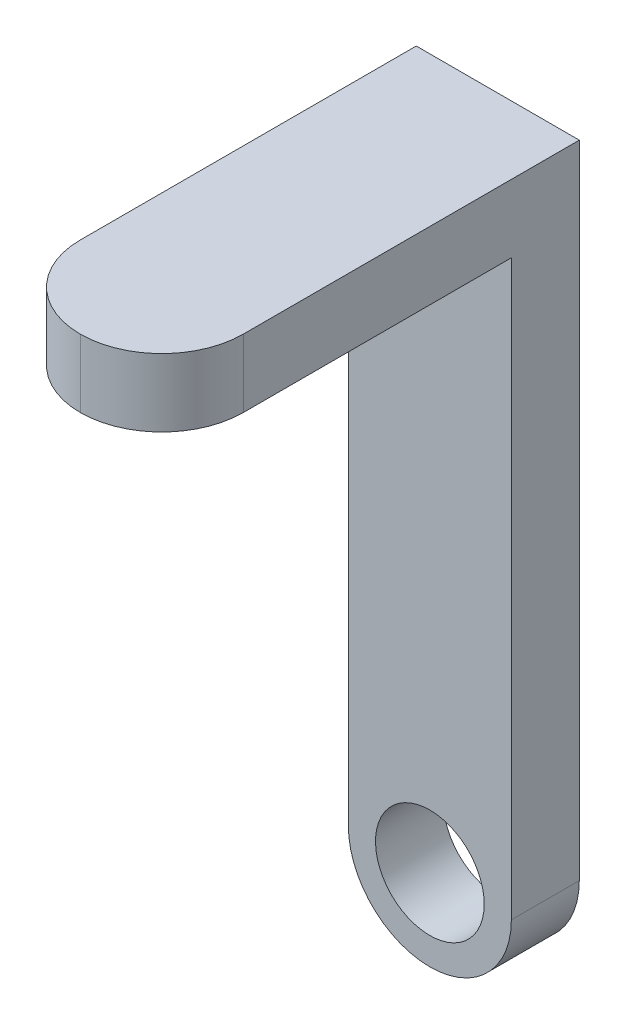
ISO-10303-21;
HEADER;
FILE_DESCRIPTION(('STEP AP214'),'2;1');
FILE_NAME('part.step','',(''),(''),'','','');
FILE_SCHEMA(('AUTOMOTIVE_DESIGN { 1 0 10303 214 1 1 1 1 }'));
ENDSEC;
DATA;
#1=APPLICATION_CONTEXT('core data for automotive mechanical design processes');
#2=APPLICATION_PROTOCOL_DEFINITION('international standard','automotive_design',2000,#1);
#3=PRODUCT_CONTEXT('',#1,'mechanical');
#4=PRODUCT('Part','Part','',(#3));
#5=PRODUCT_RELATED_PRODUCT_CATEGORY('part','',(#4));
#6=PRODUCT_DEFINITION_FORMATION('','',#4);
#7=PRODUCT_DEFINITION_CONTEXT('part definition',#1,'design');
#8=PRODUCT_DEFINITION('design','',#6,#7);
#9=PRODUCT_DEFINITION_SHAPE('','',#8);
#10=(LENGTH_UNIT() NAMED_UNIT(*) SI_UNIT(.MILLI.,.METRE.));
#11=(NAMED_UNIT(*) PLANE_ANGLE_UNIT() SI_UNIT($,.RADIAN.));
#12=(NAMED_UNIT(*) SI_UNIT($,.STERADIAN.) SOLID_ANGLE_UNIT());
#13=UNCERTAINTY_MEASURE_WITH_UNIT(LENGTH_MEASURE(1.E-05),#10,'distance_accuracy_value','');
#14=(GEOMETRIC_REPRESENTATION_CONTEXT(3) GLOBAL_UNCERTAINTY_ASSIGNED_CONTEXT((#13)) GLOBAL_UNIT_ASSIGNED_CONTEXT((#10,
#11,#12)) REPRESENTATION_CONTEXT('',''));
#15=CARTESIAN_POINT('',(0.,0.,0.));
#16=DIRECTION('',(0.,0.,1.));
#17=DIRECTION('',(1.,0.,0.));
#18=AXIS2_PLACEMENT_3D('',#15,#16,#17);
#19=CARTESIAN_POINT('',(-2.64575131106459,3.,5.));
#20=DIRECTION('',(0.,-1.,0.));
#21=DIRECTION('',(0.,0.,-1.));
#22=AXIS2_PLACEMENT_3D('',#19,#20,#21);
#23=PLANE('',#22);
#24=DIRECTION('',(0.,0.,-1.));
#25=VECTOR('',#24,1.);
#26=CARTESIAN_POINT('',(2.64575131106459,3.,5.));
#27=LINE('',#26,#25);
#28=CARTESIAN_POINT('',(2.64575131106459,3.,2.));
#29=VERTEX_POINT('',#28);
#30=CARTESIAN_POINT('',(2.64575131106459,3.,0.));
#31=VERTEX_POINT('',#30);
#32=EDGE_CURVE('E184',#29,#31,#27,.T.);
#33=ORIENTED_EDGE('',*,*,#32,.F.);
#34=DIRECTION('',(-1.,0.,0.));
#35=VECTOR('',#34,1.);
#36=CARTESIAN_POINT('',(-2.64575131106459,3.,2.));
#37=LINE('',#36,#35);
#38=CARTESIAN_POINT('',(-2.64575131106459,3.,2.));
#39=VERTEX_POINT('',#38);
#40=EDGE_CURVE('E190',#29,#39,#37,.T.);
#41=ORIENTED_EDGE('',*,*,#40,.T.);
#42=DIRECTION('',(0.,0.,-1.));
#43=VECTOR('',#42,1.);
#44=CARTESIAN_POINT('',(-2.64575131106459,3.,5.));
#45=LINE('',#44,#43);
#46=CARTESIAN_POINT('',(-2.64575131106459,3.,0.));
#47=VERTEX_POINT('',#46);
#48=EDGE_CURVE('E174',#39,#47,#45,.T.);
#49=ORIENTED_EDGE('',*,*,#48,.T.);
#50=DIRECTION('',(-1.,0.,0.));
#51=VECTOR('',#50,1.);
#52=CARTESIAN_POINT('',(-2.64575131106459,3.,0.));
#53=LINE('',#52,#51);
#54=EDGE_CURVE('E175',#31,#47,#53,.T.);
#55=ORIENTED_EDGE('',*,*,#54,.F.);
#56=EDGE_LOOP('',(#33,#41,#49,#55));
#57=FACE_BOUND('',#56,.T.);
#58=ADVANCED_FACE('F39',(#57),#23,.T.);
#59=CARTESIAN_POINT('',(0.,0.,5.));
#60=DIRECTION('',(0.,0.,1.));
#61=DIRECTION('',(1.,0.,0.));
#62=AXIS2_PLACEMENT_3D('',#59,#60,#61);
#63=PLANE('',#62);
#64=DIRECTION('',(1.,0.,0.));
#65=VECTOR('',#64,1.);
#66=CARTESIAN_POINT('',(-6.,42.2,5.));
#67=LINE('',#66,#65);
#68=CARTESIAN_POINT('',(-6.,42.2,5.));
#69=VERTEX_POINT('',#68);
#70=CARTESIAN_POINT('',(6.,42.2,5.));
#71=VERTEX_POINT('',#70);
#72=EDGE_CURVE('E118',#69,#71,#67,.T.);
#73=ORIENTED_EDGE('',*,*,#72,.F.);
#74=DIRECTION('',(0.,-1.,0.));
#75=VECTOR('',#74,1.);
#76=CARTESIAN_POINT('',(-6.,0.,5.));
#77=LINE('',#76,#75);
#78=CARTESIAN_POINT('',(-6.,0.,5.));
#79=VERTEX_POINT('',#78);
#80=EDGE_CURVE('E129',#69,#79,#77,.T.);
#81=ORIENTED_EDGE('',*,*,#80,.T.);
#82=CARTESIAN_POINT('',(0.,0.,5.));
#83=DIRECTION('',(0.,0.,1.));
#84=DIRECTION('',(1.,0.,0.));
#85=AXIS2_PLACEMENT_3D('',#82,#83,#84);
#86=CIRCLE('',#85,6.);
#87=CARTESIAN_POINT('',(6.,0.,5.));
#88=VERTEX_POINT('',#87);
#89=EDGE_CURVE('E127',#79,#88,#86,.T.);
#90=ORIENTED_EDGE('',*,*,#89,.T.);
#91=DIRECTION('',(0.,1.,0.));
#92=VECTOR('',#91,1.);
#93=CARTESIAN_POINT('',(6.,0.,5.));
#94=LINE('',#93,#92);
#95=EDGE_CURVE('E110',#88,#71,#94,.T.);
#96=ORIENTED_EDGE('',*,*,#95,.T.);
#97=EDGE_LOOP('',(#73,#81,#90,#96));
#98=FACE_BOUND('',#97,.T.);
#99=CARTESIAN_POINT('',(0.,0.,5.));
#100=DIRECTION('',(0.,0.,1.));
#101=DIRECTION('',(1.,0.,0.));
#102=AXIS2_PLACEMENT_3D('',#99,#100,#101);
#103=CIRCLE('',#102,4.);
#104=CARTESIAN_POINT('',(4.,0.,5.));
#105=VERTEX_POINT('',#104);
#106=EDGE_CURVE('E170',#105,#105,#103,.T.);
#107=ORIENTED_EDGE('',*,*,#106,.F.);
#108=EDGE_LOOP('',(#107));
#109=FACE_BOUND('',#108,.T.);
#110=ADVANCED_FACE('F123',(#98,#109),#63,.T.);
#111=CARTESIAN_POINT('',(0.,0.,0.));
#112=DIRECTION('',(0.,0.,1.));
#113=DIRECTION('',(1.,0.,0.));
#114=AXIS2_PLACEMENT_3D('',#111,#112,#113);
#115=PLANE('',#114);
#116=CARTESIAN_POINT('',(0.,0.,0.));
#117=DIRECTION('',(0.,0.,1.));
#118=DIRECTION('',(1.,0.,0.));
#119=AXIS2_PLACEMENT_3D('',#116,#117,#118);
#120=CIRCLE('',#119,6.);
#121=CARTESIAN_POINT('',(-6.,0.,0.));
#122=VERTEX_POINT('',#121);
#123=CARTESIAN_POINT('',(6.,0.,0.));
#124=VERTEX_POINT('',#123);
#125=EDGE_CURVE('E187',#122,#124,#120,.T.);
#126=ORIENTED_EDGE('',*,*,#125,.F.);
#127=DIRECTION('',(0.,-1.,0.));
#128=VECTOR('',#127,1.);
#129=CARTESIAN_POINT('',(-6.,0.,0.));
#130=LINE('',#129,#128);
#131=CARTESIAN_POINT('',(-6.,47.2,0.));
#132=VERTEX_POINT('',#131);
#133=EDGE_CURVE('E151',#132,#122,#130,.T.);
#134=ORIENTED_EDGE('',*,*,#133,.F.);
#135=DIRECTION('',(-1.,0.,0.));
#136=VECTOR('',#135,1.);
#137=CARTESIAN_POINT('',(6.,47.2,0.));
#138=LINE('',#137,#136);
#139=CARTESIAN_POINT('',(6.,47.2,0.));
#140=VERTEX_POINT('',#139);
#141=EDGE_CURVE('E147',#140,#132,#138,.T.);
#142=ORIENTED_EDGE('',*,*,#141,.F.);
#143=DIRECTION('',(0.,1.,0.));
#144=VECTOR('',#143,1.);
#145=CARTESIAN_POINT('',(6.,0.,0.));
#146=LINE('',#145,#144);
#147=EDGE_CURVE('E143',#124,#140,#146,.T.);
#148=ORIENTED_EDGE('',*,*,#147,.F.);
#149=EDGE_LOOP('',(#126,#134,#142,#148));
#150=FACE_BOUND('',#149,.T.);
#151=CARTESIAN_POINT('',(0.,0.,0.));
#152=DIRECTION('',(0.,0.,1.));
#153=DIRECTION('',(1.,0.,0.));
#154=AXIS2_PLACEMENT_3D('',#151,#152,#153);
#155=CIRCLE('',#154,4.);
#156=EDGE_CURVE('E161',#47,#31,#155,.T.);
#157=ORIENTED_EDGE('',*,*,#156,.T.);
#158=ORIENTED_EDGE('',*,*,#54,.T.);
#159=EDGE_LOOP('',(#157,#158));
#160=FACE_BOUND('',#159,.T.);
#161=ADVANCED_FACE('F221',(#150,#160),#115,.F.);
#162=CARTESIAN_POINT('',(0.,0.,5.));
#163=DIRECTION('',(0.,0.,-1.));
#164=DIRECTION('',(-1.,0.,0.));
#165=AXIS2_PLACEMENT_3D('',#162,#163,#164);
#166=CYLINDRICAL_SURFACE('',#165,6.);
#167=ORIENTED_EDGE('',*,*,#89,.F.);
#168=DIRECTION('',(0.,0.,1.));
#169=VECTOR('',#168,1.);
#170=CARTESIAN_POINT('',(-6.,0.,0.));
#171=LINE('',#170,#169);
#172=EDGE_CURVE('E157',#122,#79,#171,.T.);
#173=ORIENTED_EDGE('',*,*,#172,.F.);
#174=ORIENTED_EDGE('',*,*,#125,.T.);
#175=DIRECTION('',(0.,0.,1.));
#176=VECTOR('',#175,1.);
#177=CARTESIAN_POINT('',(6.,0.,0.));
#178=LINE('',#177,#176);
#179=EDGE_CURVE('E153',#124,#88,#178,.T.);
#180=ORIENTED_EDGE('',*,*,#179,.T.);
#181=EDGE_LOOP('',(#167,#173,#174,#180));
#182=FACE_BOUND('',#181,.T.);
#183=ADVANCED_FACE('F225',(#182),#166,.T.);
#184=CARTESIAN_POINT('',(0.,0.,5.));
#185=DIRECTION('',(0.,0.,-1.));
#186=DIRECTION('',(-1.,0.,0.));
#187=AXIS2_PLACEMENT_3D('',#184,#185,#186);
#188=CYLINDRICAL_SURFACE('',#187,4.);
#189=CARTESIAN_POINT('',(0.,0.,2.));
#190=DIRECTION('',(0.,0.,1.));
#191=DIRECTION('',(1.,0.,0.));
#192=AXIS2_PLACEMENT_3D('',#189,#190,#191);
#193=CIRCLE('',#192,4.);
#194=EDGE_CURVE('E130',#29,#39,#193,.T.);
#195=ORIENTED_EDGE('',*,*,#194,.F.);
#196=ORIENTED_EDGE('',*,*,#32,.T.);
#197=ORIENTED_EDGE('',*,*,#156,.F.);
#198=ORIENTED_EDGE('',*,*,#48,.F.);
#199=EDGE_LOOP('',(#195,#196,#197,#198));
#200=FACE_BOUND('',#199,.T.);
#201=ORIENTED_EDGE('',*,*,#106,.T.);
#202=EDGE_LOOP('',(#201));
#203=FACE_BOUND('',#202,.T.);
#204=ADVANCED_FACE('F245',(#200,#203),#188,.F.);
#205=CARTESIAN_POINT('',(-6.,0.,0.));
#206=DIRECTION('',(-1.,0.,0.));
#207=DIRECTION('',(0.,0.,1.));
#208=AXIS2_PLACEMENT_3D('',#205,#206,#207);
#209=PLANE('',#208);
#210=DIRECTION('',(0.,0.,-1.));
#211=VECTOR('',#210,1.);
#212=CARTESIAN_POINT('',(-6.,42.2,30.73));
#213=LINE('',#212,#211);
#214=CARTESIAN_POINT('',(-6.,42.2,24.73));
#215=VERTEX_POINT('',#214);
#216=EDGE_CURVE('E117',#215,#69,#213,.T.);
#217=ORIENTED_EDGE('',*,*,#216,.F.);
#218=DIRECTION('',(0.,-1.,0.));
#219=VECTOR('',#218,1.);
#220=CARTESIAN_POINT('',(-6.,0.,24.73));
#221=LINE('',#220,#219);
#222=CARTESIAN_POINT('',(-6.,47.2,24.73));
#223=VERTEX_POINT('',#222);
#224=EDGE_CURVE('E203',#215,#223,#221,.F.);
#225=ORIENTED_EDGE('',*,*,#224,.T.);
#226=DIRECTION('',(0.,0.,1.));
#227=VECTOR('',#226,1.);
#228=CARTESIAN_POINT('',(-6.,47.2,0.));
#229=LINE('',#228,#227);
#230=EDGE_CURVE('E162',#132,#223,#229,.T.);
#231=ORIENTED_EDGE('',*,*,#230,.F.);
#232=ORIENTED_EDGE('',*,*,#133,.T.);
#233=ORIENTED_EDGE('',*,*,#172,.T.);
#234=ORIENTED_EDGE('',*,*,#80,.F.);
#235=EDGE_LOOP('',(#217,#225,#231,#232,#233,#234));
#236=FACE_BOUND('',#235,.T.);
#237=ADVANCED_FACE('F212',(#236),#209,.T.);
#238=CARTESIAN_POINT('',(6.,47.2,0.));
#239=DIRECTION('',(0.,1.,0.));
#240=DIRECTION('',(0.,0.,1.));
#241=AXIS2_PLACEMENT_3D('',#238,#239,#240);
#242=PLANE('',#241);
#243=ORIENTED_EDGE('',*,*,#230,.T.);
#244=CARTESIAN_POINT('',(0.,47.2,24.73));
#245=DIRECTION('',(0.,1.,0.));
#246=DIRECTION('',(0.,0.,1.));
#247=AXIS2_PLACEMENT_3D('',#244,#245,#246);
#248=CIRCLE('',#247,6.);
#249=CARTESIAN_POINT('',(0.,47.2,30.73));
#250=VERTEX_POINT('',#249);
#251=EDGE_CURVE('E49',#223,#250,#248,.T.);
#252=ORIENTED_EDGE('',*,*,#251,.T.);
#253=CARTESIAN_POINT('',(0.,47.2,24.73));
#254=DIRECTION('',(0.,1.,0.));
#255=DIRECTION('',(0.,0.,1.));
#256=AXIS2_PLACEMENT_3D('',#253,#254,#255);
#257=CIRCLE('',#256,6.);
#258=CARTESIAN_POINT('',(6.,47.2,24.73));
#259=VERTEX_POINT('',#258);
#260=EDGE_CURVE('E56',#250,#259,#257,.T.);
#261=ORIENTED_EDGE('',*,*,#260,.T.);
#262=DIRECTION('',(0.,0.,1.));
#263=VECTOR('',#262,1.);
#264=CARTESIAN_POINT('',(6.,47.2,0.));
#265=LINE('',#264,#263);
#266=EDGE_CURVE('E165',#140,#259,#265,.T.);
#267=ORIENTED_EDGE('',*,*,#266,.F.);
#268=ORIENTED_EDGE('',*,*,#141,.T.);
#269=EDGE_LOOP('',(#243,#252,#261,#267,#268));
#270=FACE_BOUND('',#269,.T.);
#271=ADVANCED_FACE('F215',(#270),#242,.T.);
#272=CARTESIAN_POINT('',(6.,0.,0.));
#273=DIRECTION('',(1.,0.,0.));
#274=DIRECTION('',(0.,0.,-1.));
#275=AXIS2_PLACEMENT_3D('',#272,#273,#274);
#276=PLANE('',#275);
#277=ORIENTED_EDGE('',*,*,#266,.T.);
#278=DIRECTION('',(0.,1.,0.));
#279=VECTOR('',#278,1.);
#280=CARTESIAN_POINT('',(6.,0.,24.73));
#281=LINE('',#280,#279);
#282=CARTESIAN_POINT('',(6.,42.2,24.73));
#283=VERTEX_POINT('',#282);
#284=EDGE_CURVE('E11',#259,#283,#281,.F.);
#285=ORIENTED_EDGE('',*,*,#284,.T.);
#286=DIRECTION('',(0.,0.,-1.));
#287=VECTOR('',#286,1.);
#288=CARTESIAN_POINT('',(6.,42.2,30.73));
#289=LINE('',#288,#287);
#290=EDGE_CURVE('E107',#283,#71,#289,.T.);
#291=ORIENTED_EDGE('',*,*,#290,.T.);
#292=ORIENTED_EDGE('',*,*,#95,.F.);
#293=ORIENTED_EDGE('',*,*,#179,.F.);
#294=ORIENTED_EDGE('',*,*,#147,.T.);
#295=EDGE_LOOP('',(#277,#285,#291,#292,#293,#294));
#296=FACE_BOUND('',#295,.T.);
#297=ADVANCED_FACE('F109',(#296),#276,.T.);
#298=CARTESIAN_POINT('',(0.,0.,2.));
#299=DIRECTION('',(0.,0.,1.));
#300=DIRECTION('',(1.,0.,0.));
#301=AXIS2_PLACEMENT_3D('',#298,#299,#300);
#302=PLANE('',#301);
#303=ORIENTED_EDGE('',*,*,#194,.T.);
#304=ORIENTED_EDGE('',*,*,#40,.F.);
#305=EDGE_LOOP('',(#303,#304));
#306=FACE_BOUND('',#305,.T.);
#307=ADVANCED_FACE('F278',(#306),#302,.T.);
#308=CARTESIAN_POINT('',(-6.,42.2,30.73));
#309=DIRECTION('',(0.,1.,0.));
#310=DIRECTION('',(0.,0.,1.));
#311=AXIS2_PLACEMENT_3D('',#308,#309,#310);
#312=PLANE('',#311);
#313=CARTESIAN_POINT('',(0.,42.2,24.73));
#314=DIRECTION('',(0.,1.,0.));
#315=DIRECTION('',(0.,0.,1.));
#316=AXIS2_PLACEMENT_3D('',#313,#314,#315);
#317=CIRCLE('',#316,6.);
#318=CARTESIAN_POINT('',(0.,42.2,30.73));
#319=VERTEX_POINT('',#318);
#320=EDGE_CURVE('E197',#283,#319,#317,.F.);
#321=ORIENTED_EDGE('',*,*,#320,.T.);
#322=CARTESIAN_POINT('',(0.,42.2,24.73));
#323=DIRECTION('',(0.,1.,0.));
#324=DIRECTION('',(0.,0.,1.));
#325=AXIS2_PLACEMENT_3D('',#322,#323,#324);
#326=CIRCLE('',#325,6.);
#327=EDGE_CURVE('E200',#319,#215,#326,.F.);
#328=ORIENTED_EDGE('',*,*,#327,.T.);
#329=ORIENTED_EDGE('',*,*,#216,.T.);
#330=ORIENTED_EDGE('',*,*,#72,.T.);
#331=ORIENTED_EDGE('',*,*,#290,.F.);
#332=EDGE_LOOP('',(#321,#328,#329,#330,#331));
#333=FACE_BOUND('',#332,.T.);
#334=ADVANCED_FACE('F132',(#333),#312,.F.);
#335=CARTESIAN_POINT('',(0.,0.,24.73));
#336=DIRECTION('',(0.,1.,0.));
#337=DIRECTION('',(0.,0.,1.));
#338=AXIS2_PLACEMENT_3D('',#335,#336,#337);
#339=CYLINDRICAL_SURFACE('',#338,6.);
#340=ORIENTED_EDGE('',*,*,#284,.F.);
#341=ORIENTED_EDGE('',*,*,#260,.F.);
#342=DIRECTION('',(0.,1.,0.));
#343=VECTOR('',#342,1.);
#344=CARTESIAN_POINT('',(0.,0.,30.73));
#345=LINE('',#344,#343);
#346=EDGE_CURVE('E43',#319,#250,#345,.T.);
#347=ORIENTED_EDGE('',*,*,#346,.F.);
#348=ORIENTED_EDGE('',*,*,#320,.F.);
#349=EDGE_LOOP('',(#340,#341,#347,#348));
#350=FACE_BOUND('',#349,.T.);
#351=ADVANCED_FACE('F41',(#350),#339,.T.);
#352=CARTESIAN_POINT('',(0.,0.,24.73));
#353=DIRECTION('',(0.,-1.,0.));
#354=DIRECTION('',(0.,0.,-1.));
#355=AXIS2_PLACEMENT_3D('',#352,#353,#354);
#356=CYLINDRICAL_SURFACE('',#355,6.);
#357=ORIENTED_EDGE('',*,*,#251,.F.);
#358=ORIENTED_EDGE('',*,*,#224,.F.);
#359=ORIENTED_EDGE('',*,*,#327,.F.);
#360=ORIENTED_EDGE('',*,*,#346,.T.);
#361=EDGE_LOOP('',(#357,#358,#359,#360));
#362=FACE_BOUND('',#361,.T.);
#363=ADVANCED_FACE('F228',(#362),#356,.T.);
#364=CLOSED_SHELL('',(#58,#110,#161,#183,#204,#237,#271,#297,#307,#334,#351,#363));
#365=MANIFOLD_SOLID_BREP('B2',#364);
#366=ADVANCED_BREP_SHAPE_REPRESENTATION('',(#18,#365),#14);
#367=SHAPE_DEFINITION_REPRESENTATION(#9,#366);
ENDSEC;
END-ISO-10303-21;
